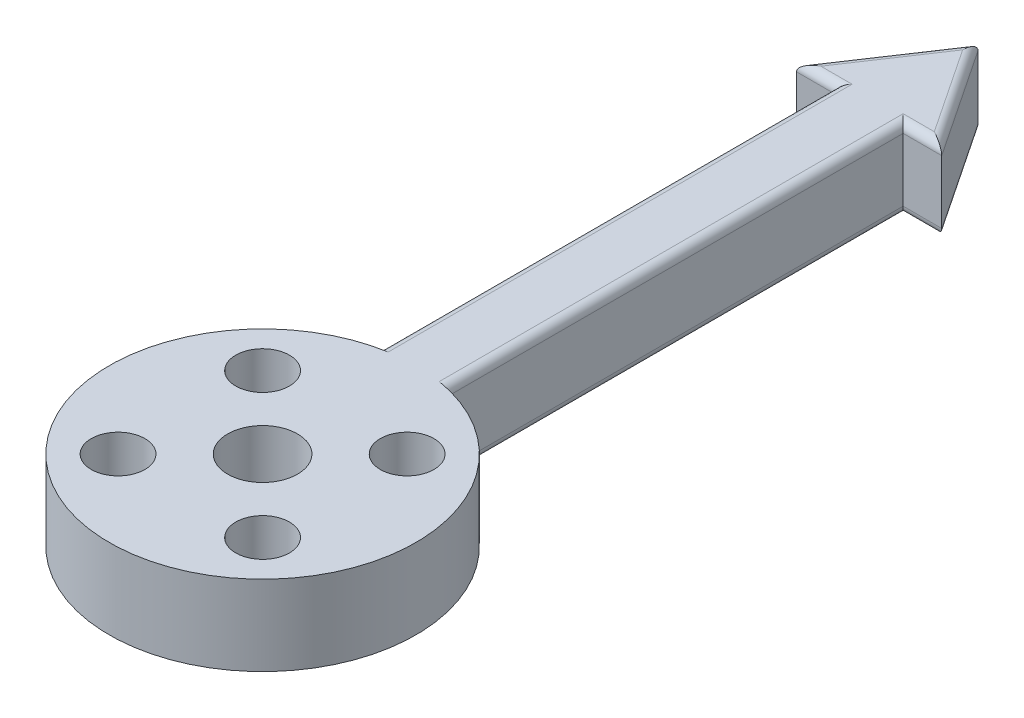
ISO-10303-21;
HEADER;
FILE_DESCRIPTION(('STEP AP214'),'2;1');
FILE_NAME('part.step','',(''),(''),'','','');
FILE_SCHEMA(('AUTOMOTIVE_DESIGN { 1 0 10303 214 1 1 1 1 }'));
ENDSEC;
DATA;
#1=APPLICATION_CONTEXT('core data for automotive mechanical design processes');
#2=APPLICATION_PROTOCOL_DEFINITION('international standard','automotive_design',2000,#1);
#3=PRODUCT_CONTEXT('',#1,'mechanical');
#4=PRODUCT('Part','Part','',(#3));
#5=PRODUCT_RELATED_PRODUCT_CATEGORY('part','',(#4));
#6=PRODUCT_DEFINITION_FORMATION('','',#4);
#7=PRODUCT_DEFINITION_CONTEXT('part definition',#1,'design');
#8=PRODUCT_DEFINITION('design','',#6,#7);
#9=PRODUCT_DEFINITION_SHAPE('','',#8);
#10=(LENGTH_UNIT() NAMED_UNIT(*) SI_UNIT(.MILLI.,.METRE.));
#11=(NAMED_UNIT(*) PLANE_ANGLE_UNIT() SI_UNIT($,.RADIAN.));
#12=(NAMED_UNIT(*) SI_UNIT($,.STERADIAN.) SOLID_ANGLE_UNIT());
#13=UNCERTAINTY_MEASURE_WITH_UNIT(LENGTH_MEASURE(1.E-05),#10,'distance_accuracy_value','');
#14=(GEOMETRIC_REPRESENTATION_CONTEXT(3) GLOBAL_UNCERTAINTY_ASSIGNED_CONTEXT((#13)) GLOBAL_UNIT_ASSIGNED_CONTEXT((#10,
#11,#12)) REPRESENTATION_CONTEXT('',''));
#15=CARTESIAN_POINT('',(0.,0.,0.));
#16=DIRECTION('',(0.,0.,1.));
#17=DIRECTION('',(1.,0.,0.));
#18=AXIS2_PLACEMENT_3D('',#15,#16,#17);
#19=CARTESIAN_POINT('',(0.,4.7,0.));
#20=DIRECTION('',(0.,1.,0.));
#21=DIRECTION('',(0.,0.,1.));
#22=AXIS2_PLACEMENT_3D('',#19,#20,#21);
#23=PLANE('',#22);
#24=CARTESIAN_POINT('',(4.24264068711929,4.7,4.24264068711927));
#25=DIRECTION('',(0.,1.,0.));
#26=DIRECTION('',(0.,0.,1.));
#27=AXIS2_PLACEMENT_3D('',#24,#25,#26);
#28=CIRCLE('',#27,1.575);
#29=CARTESIAN_POINT('',(4.24264068711929,4.7,5.81764068711927));
#30=VERTEX_POINT('',#29);
#31=EDGE_CURVE('E353',#30,#30,#28,.T.);
#32=ORIENTED_EDGE('',*,*,#31,.F.);
#33=EDGE_LOOP('',(#32));
#34=FACE_BOUND('',#33,.T.);
#35=CARTESIAN_POINT('',(-4.24264068711929,4.7,-4.24264068711928));
#36=DIRECTION('',(0.,1.,0.));
#37=DIRECTION('',(0.,0.,1.));
#38=AXIS2_PLACEMENT_3D('',#35,#36,#37);
#39=CIRCLE('',#38,1.575);
#40=CARTESIAN_POINT('',(-4.24264068711929,4.7,-2.66764068711928));
#41=VERTEX_POINT('',#40);
#42=EDGE_CURVE('E365',#41,#41,#39,.T.);
#43=ORIENTED_EDGE('',*,*,#42,.F.);
#44=EDGE_LOOP('',(#43));
#45=FACE_BOUND('',#44,.T.);
#46=CARTESIAN_POINT('',(0.,4.7,0.));
#47=DIRECTION('',(0.,1.,0.));
#48=DIRECTION('',(0.,0.,1.));
#49=AXIS2_PLACEMENT_3D('',#46,#47,#48);
#50=CIRCLE('',#49,9.);
#51=CARTESIAN_POINT('',(-1.5,4.7,-8.87411967464942));
#52=VERTEX_POINT('',#51);
#53=CARTESIAN_POINT('',(1.5,4.7,-8.87411967464942));
#54=VERTEX_POINT('',#53);
#55=EDGE_CURVE('E149',#52,#54,#50,.T.);
#56=ORIENTED_EDGE('',*,*,#55,.T.);
#57=DIRECTION('',(0.,0.,-1.));
#58=VECTOR('',#57,1.);
#59=CARTESIAN_POINT('',(1.5,4.7,0.));
#60=LINE('',#59,#58);
#61=CARTESIAN_POINT('',(1.5,4.7,-36.1063758050143));
#62=VERTEX_POINT('',#61);
#63=EDGE_CURVE('E198',#54,#62,#60,.T.);
#64=ORIENTED_EDGE('',*,*,#63,.T.);
#65=DIRECTION('',(1.,0.,0.));
#66=VECTOR('',#65,1.);
#67=CARTESIAN_POINT('',(0.,4.7,-36.1063758050143));
#68=LINE('',#67,#66);
#69=CARTESIAN_POINT('',(3.33042474295131,4.7,-36.1063758050143));
#70=VERTEX_POINT('',#69);
#71=EDGE_CURVE('E195',#62,#70,#68,.T.);
#72=ORIENTED_EDGE('',*,*,#71,.T.);
#73=DIRECTION('',(-0.554932665474473,0.,-0.831895267921027));
#74=VECTOR('',#73,1.);
#75=CARTESIAN_POINT('',(18.9731784198062,4.7,-12.6564447221081));
#76=LINE('',#75,#74);
#77=CARTESIAN_POINT('',(0.,4.7,-41.0989897854139));
#78=VERTEX_POINT('',#77);
#79=EDGE_CURVE('E193',#70,#78,#76,.T.);
#80=ORIENTED_EDGE('',*,*,#79,.T.);
#81=DIRECTION('',(-0.554932665474473,0.,0.831895267921027));
#82=VECTOR('',#81,1.);
#83=CARTESIAN_POINT('',(-18.9731784198062,4.7,-12.6564447221081));
#84=LINE('',#83,#82);
#85=CARTESIAN_POINT('',(-3.3304247429513,4.7,-36.1063758050143));
#86=VERTEX_POINT('',#85);
#87=EDGE_CURVE('E191',#78,#86,#84,.T.);
#88=ORIENTED_EDGE('',*,*,#87,.T.);
#89=DIRECTION('',(1.,0.,0.));
#90=VECTOR('',#89,1.);
#91=CARTESIAN_POINT('',(0.,4.7,-36.1063758050143));
#92=LINE('',#91,#90);
#93=CARTESIAN_POINT('',(-1.5,4.7,-36.1063758050143));
#94=VERTEX_POINT('',#93);
#95=EDGE_CURVE('E189',#86,#94,#92,.T.);
#96=ORIENTED_EDGE('',*,*,#95,.T.);
#97=DIRECTION('',(0.,0.,1.));
#98=VECTOR('',#97,1.);
#99=CARTESIAN_POINT('',(-1.5,4.7,0.));
#100=LINE('',#99,#98);
#101=EDGE_CURVE('E186',#94,#52,#100,.T.);
#102=ORIENTED_EDGE('',*,*,#101,.T.);
#103=EDGE_LOOP('',(#56,#64,#72,#80,#88,#96,#102));
#104=FACE_BOUND('',#103,.T.);
#105=CARTESIAN_POINT('',(0.,4.7,0.));
#106=DIRECTION('',(0.,1.,0.));
#107=DIRECTION('',(0.,0.,1.));
#108=AXIS2_PLACEMENT_3D('',#105,#106,#107);
#109=CIRCLE('',#108,2.05);
#110=CARTESIAN_POINT('',(0.,4.7,2.05));
#111=VERTEX_POINT('',#110);
#112=EDGE_CURVE('E150',#111,#111,#109,.T.);
#113=ORIENTED_EDGE('',*,*,#112,.F.);
#114=EDGE_LOOP('',(#113));
#115=FACE_BOUND('',#114,.T.);
#116=CARTESIAN_POINT('',(-4.24264068711928,4.7,4.24264068711929));
#117=DIRECTION('',(0.,1.,0.));
#118=DIRECTION('',(0.,0.,1.));
#119=AXIS2_PLACEMENT_3D('',#116,#117,#118);
#120=CIRCLE('',#119,1.575);
#121=CARTESIAN_POINT('',(-4.24264068711928,4.7,5.81764068711929));
#122=VERTEX_POINT('',#121);
#123=EDGE_CURVE('E359',#122,#122,#120,.T.);
#124=ORIENTED_EDGE('',*,*,#123,.F.);
#125=EDGE_LOOP('',(#124));
#126=FACE_BOUND('',#125,.T.);
#127=CARTESIAN_POINT('',(4.24264068711927,4.7,-4.2426406871193));
#128=DIRECTION('',(0.,1.,0.));
#129=DIRECTION('',(0.,0.,1.));
#130=AXIS2_PLACEMENT_3D('',#127,#128,#129);
#131=CIRCLE('',#130,1.575);
#132=CARTESIAN_POINT('',(4.24264068711927,4.7,-2.6676406871193));
#133=VERTEX_POINT('',#132);
#134=EDGE_CURVE('E345',#133,#133,#131,.T.);
#135=ORIENTED_EDGE('',*,*,#134,.F.);
#136=EDGE_LOOP('',(#135));
#137=FACE_BOUND('',#136,.T.);
#138=ADVANCED_FACE('F37',(#34,#45,#104,#115,#126,#137),#23,.T.);
#139=CARTESIAN_POINT('',(0.,0.,0.));
#140=DIRECTION('',(0.,1.,0.));
#141=DIRECTION('',(0.,0.,1.));
#142=AXIS2_PLACEMENT_3D('',#139,#140,#141);
#143=PLANE('',#142);
#144=DIRECTION('',(0.,0.,1.));
#145=VECTOR('',#144,1.);
#146=CARTESIAN_POINT('',(1.5,0.,-8.77496438739212));
#147=LINE('',#146,#145);
#148=CARTESIAN_POINT('',(1.5,0.,-36.1063758050143));
#149=VERTEX_POINT('',#148);
#150=CARTESIAN_POINT('',(1.5,0.,-8.87411967464942));
#151=VERTEX_POINT('',#150);
#152=EDGE_CURVE('E147',#149,#151,#147,.T.);
#153=ORIENTED_EDGE('',*,*,#152,.T.);
#154=CARTESIAN_POINT('',(0.,0.,0.));
#155=DIRECTION('',(0.,1.,0.));
#156=DIRECTION('',(0.,0.,1.));
#157=AXIS2_PLACEMENT_3D('',#154,#155,#156);
#158=CIRCLE('',#157,9.);
#159=CARTESIAN_POINT('',(-1.5,0.,-8.87411967464942));
#160=VERTEX_POINT('',#159);
#161=EDGE_CURVE('E139',#160,#151,#158,.T.);
#162=ORIENTED_EDGE('',*,*,#161,.F.);
#163=DIRECTION('',(0.,0.,-1.));
#164=VECTOR('',#163,1.);
#165=CARTESIAN_POINT('',(-1.5,0.,-35.6063758050143));
#166=LINE('',#165,#164);
#167=CARTESIAN_POINT('',(-1.5,0.,-36.1063758050143));
#168=VERTEX_POINT('',#167);
#169=EDGE_CURVE('E144',#160,#168,#166,.T.);
#170=ORIENTED_EDGE('',*,*,#169,.T.);
#171=DIRECTION('',(-1.,0.,0.));
#172=VECTOR('',#171,1.);
#173=CARTESIAN_POINT('',(-4.26499711367795,0.,-36.1063758050143));
#174=LINE('',#173,#172);
#175=CARTESIAN_POINT('',(-3.3304247429513,0.,-36.1063758050143));
#176=VERTEX_POINT('',#175);
#177=EDGE_CURVE('E162',#168,#176,#174,.T.);
#178=ORIENTED_EDGE('',*,*,#177,.T.);
#179=DIRECTION('',(0.554932665474473,0.,-0.831895267921027));
#180=VECTOR('',#179,1.);
#181=CARTESIAN_POINT('',(0.415947633960519,0.,-41.7225336672628));
#182=LINE('',#181,#180);
#183=CARTESIAN_POINT('',(0.,0.,-41.0989897854139));
#184=VERTEX_POINT('',#183);
#185=EDGE_CURVE('E164',#176,#184,#182,.T.);
#186=ORIENTED_EDGE('',*,*,#185,.T.);
#187=DIRECTION('',(0.554932665474473,0.,0.831895267921027));
#188=VECTOR('',#187,1.);
#189=CARTESIAN_POINT('',(3.84904947971744,0.,-35.328909472277));
#190=LINE('',#189,#188);
#191=CARTESIAN_POINT('',(3.33042474295131,0.,-36.1063758050143));
#192=VERTEX_POINT('',#191);
#193=EDGE_CURVE('E169',#184,#192,#190,.T.);
#194=ORIENTED_EDGE('',*,*,#193,.T.);
#195=DIRECTION('',(-1.,0.,0.));
#196=VECTOR('',#195,1.);
#197=CARTESIAN_POINT('',(2.,0.,-36.1063758050143));
#198=LINE('',#197,#196);
#199=EDGE_CURVE('E171',#192,#149,#198,.T.);
#200=ORIENTED_EDGE('',*,*,#199,.T.);
#201=EDGE_LOOP('',(#153,#162,#170,#178,#186,#194,#200));
#202=FACE_BOUND('',#201,.T.);
#203=CARTESIAN_POINT('',(0.,0.,0.));
#204=DIRECTION('',(0.,1.,0.));
#205=DIRECTION('',(0.,0.,1.));
#206=AXIS2_PLACEMENT_3D('',#203,#204,#205);
#207=CIRCLE('',#206,2.05);
#208=CARTESIAN_POINT('',(0.,0.,2.05));
#209=VERTEX_POINT('',#208);
#210=EDGE_CURVE('E368',#209,#209,#207,.T.);
#211=ORIENTED_EDGE('',*,*,#210,.T.);
#212=EDGE_LOOP('',(#211));
#213=FACE_BOUND('',#212,.T.);
#214=CARTESIAN_POINT('',(-4.24264068711929,0.,-4.24264068711928));
#215=DIRECTION('',(0.,1.,0.));
#216=DIRECTION('',(0.,0.,1.));
#217=AXIS2_PLACEMENT_3D('',#214,#215,#216);
#218=CIRCLE('',#217,1.575);
#219=CARTESIAN_POINT('',(-4.24264068711929,0.,-2.66764068711928));
#220=VERTEX_POINT('',#219);
#221=EDGE_CURVE('E362',#220,#220,#218,.T.);
#222=ORIENTED_EDGE('',*,*,#221,.T.);
#223=EDGE_LOOP('',(#222));
#224=FACE_BOUND('',#223,.T.);
#225=CARTESIAN_POINT('',(-4.24264068711928,0.,4.24264068711929));
#226=DIRECTION('',(0.,1.,0.));
#227=DIRECTION('',(0.,0.,1.));
#228=AXIS2_PLACEMENT_3D('',#225,#226,#227);
#229=CIRCLE('',#228,1.575);
#230=CARTESIAN_POINT('',(-4.24264068711928,0.,5.81764068711929));
#231=VERTEX_POINT('',#230);
#232=EDGE_CURVE('E356',#231,#231,#229,.T.);
#233=ORIENTED_EDGE('',*,*,#232,.T.);
#234=EDGE_LOOP('',(#233));
#235=FACE_BOUND('',#234,.T.);
#236=CARTESIAN_POINT('',(4.24264068711929,0.,4.24264068711927));
#237=DIRECTION('',(0.,1.,0.));
#238=DIRECTION('',(0.,0.,1.));
#239=AXIS2_PLACEMENT_3D('',#236,#237,#238);
#240=CIRCLE('',#239,1.575);
#241=CARTESIAN_POINT('',(4.24264068711929,0.,5.81764068711927));
#242=VERTEX_POINT('',#241);
#243=EDGE_CURVE('E348',#242,#242,#240,.T.);
#244=ORIENTED_EDGE('',*,*,#243,.T.);
#245=EDGE_LOOP('',(#244));
#246=FACE_BOUND('',#245,.T.);
#247=CARTESIAN_POINT('',(4.24264068711927,0.,-4.2426406871193));
#248=DIRECTION('',(0.,1.,0.));
#249=DIRECTION('',(0.,0.,1.));
#250=AXIS2_PLACEMENT_3D('',#247,#248,#249);
#251=CIRCLE('',#250,1.575);
#252=CARTESIAN_POINT('',(4.24264068711927,0.,-2.6676406871193));
#253=VERTEX_POINT('',#252);
#254=EDGE_CURVE('E349',#253,#253,#251,.T.);
#255=ORIENTED_EDGE('',*,*,#254,.T.);
#256=EDGE_LOOP('',(#255));
#257=FACE_BOUND('',#256,.T.);
#258=ADVANCED_FACE('F141',(#202,#213,#224,#235,#246,#257),#143,.F.);
#259=CARTESIAN_POINT('',(0.,4.7,0.));
#260=DIRECTION('',(0.,-1.,0.));
#261=DIRECTION('',(0.,0.,-1.));
#262=AXIS2_PLACEMENT_3D('',#259,#260,#261);
#263=CYLINDRICAL_SURFACE('',#262,9.);
#264=ORIENTED_EDGE('',*,*,#161,.T.);
#265=CARTESIAN_POINT('',(1.5,0.,-8.87411967464942));
#266=CARTESIAN_POINT('',(1.52857366768559,-2.15510290243616E-05,-8.86929528128419));
#267=CARTESIAN_POINT('',(1.55711328798484,0.00244793500486232,-8.86432397944998));
#268=CARTESIAN_POINT('',(1.6133244305924,0.0121836103916337,-8.85426300443382));
#269=CARTESIAN_POINT('',(1.64099645050938,0.0194469954826103,-8.84917340213173));
#270=CARTESIAN_POINT('',(1.69471837865524,0.0385893348917998,-8.83904320058754));
#271=CARTESIAN_POINT('',(1.72076763257275,0.050470137188911,-8.83400262179454));
#272=CARTESIAN_POINT('',(1.77049356807728,0.0785175592642949,-8.82417098797605));
#273=CARTESIAN_POINT('',(1.79417066519858,0.0946834266061128,-8.81937988931961));
#274=CARTESIAN_POINT('',(1.8384269039602,0.130835896918449,-8.81026091521211));
#275=CARTESIAN_POINT('',(1.85901209499855,0.150814860761542,-8.80593214013922));
#276=CARTESIAN_POINT('',(1.89652364257216,0.19407770593054,-8.79792968970481));
#277=CARTESIAN_POINT('',(1.91344952420451,0.217362015573363,-8.79425609938358));
#278=CARTESIAN_POINT('',(1.94285771161938,0.266171022688308,-8.78780562653102));
#279=CARTESIAN_POINT('',(1.9554079225013,0.291653037123858,-8.78501510931863));
#280=CARTESIAN_POINT('',(1.97602762824572,0.344440631991479,-8.78040018686233));
#281=CARTESIAN_POINT('',(1.98410125791107,0.37174450345314,-8.77857489016304));
#282=CARTESIAN_POINT('',(1.99319228185887,0.416056029680713,-8.77651389649273));
#283=CARTESIAN_POINT('',(1.9957434690092,0.43274832288734,-8.77593374258027));
#284=CARTESIAN_POINT('',(1.9991469482704,0.46629100344544,-8.77515883242661));
#285=CARTESIAN_POINT('',(2.00000154859611,0.483141144621757,-8.77496355256496));
#286=CARTESIAN_POINT('',(2.,0.5,-8.77496438739212));
#287=B_SPLINE_CURVE_WITH_KNOTS('',3,(#265,#266,#267,#268,#269,#270,#271,#272,#273,#274,#275,
#276,#277,#278,#279,#280,#281,#282,#283,#284,#285,#286),.UNSPECIFIED.,.F.,.F.,(4,2,2,2,2,2,2,2,
2,2,4),(0.,0.0868162135104531,0.173581687554039,0.26038192262273,0.347166926080157,
0.433779856325748,0.520404020405123,0.605616837146022,0.6907508152316,0.741356534728941,
0.791893357579761),.UNSPECIFIED.);
#288=CARTESIAN_POINT('',(2.,0.5,-8.77496438739212));
#289=VERTEX_POINT('',#288);
#290=EDGE_CURVE('E211',#151,#289,#287,.T.);
#291=ORIENTED_EDGE('',*,*,#290,.T.);
#292=DIRECTION('',(0.,1.,0.));
#293=VECTOR('',#292,1.);
#294=CARTESIAN_POINT('',(2.,-34.3025333317787,-8.77496438739212));
#295=LINE('',#294,#293);
#296=CARTESIAN_POINT('',(2.,4.2,-8.77496438739212));
#297=VERTEX_POINT('',#296);
#298=EDGE_CURVE('E337',#289,#297,#295,.T.);
#299=ORIENTED_EDGE('',*,*,#298,.T.);
#300=CARTESIAN_POINT('',(2.,4.2,-8.77496438739212));
#301=CARTESIAN_POINT('',(2.0000259749314,4.2276586310233,-8.77495473762469));
#302=CARTESIAN_POINT('',(1.99770668779364,4.25530499134648,-8.77548703518185));
#303=CARTESIAN_POINT('',(1.98857547794365,4.30976321890986,-8.77756268389682));
#304=CARTESIAN_POINT('',(1.98177069187122,4.33657634102491,-8.77910442895008));
#305=CARTESIAN_POINT('',(1.96386360374433,4.38865554502999,-8.78312692140167));
#306=CARTESIAN_POINT('',(1.95276051889964,4.41392134415602,-8.78560783983695));
#307=CARTESIAN_POINT('',(1.92660940206455,4.46221786035978,-8.79137964475677));
#308=CARTESIAN_POINT('',(1.91156111471106,4.48524843262461,-8.79467058367107));
#309=CARTESIAN_POINT('',(1.87775252020999,4.52874188023792,-8.80195131347186));
#310=CARTESIAN_POINT('',(1.85894858475035,4.54916945664228,-8.80594924804119));
#311=CARTESIAN_POINT('',(1.81828433422215,4.58659923903385,-8.81443548270603));
#312=CARTESIAN_POINT('',(1.7964232277161,4.60360055524315,-8.81892390971377));
#313=CARTESIAN_POINT('',(1.74972955167514,4.63408526254806,-8.8283081879939));
#314=CARTESIAN_POINT('',(1.7248414218102,4.64748138900918,-8.83321091020234));
#315=CARTESIAN_POINT('',(1.67319256380394,4.66988928136201,-8.84313953426376));
#316=CARTESIAN_POINT('',(1.64643262790724,4.67890288947011,-8.84816538342482));
#317=CARTESIAN_POINT('',(1.59964196545976,4.69038146012261,-8.85672273361956));
#318=CARTESIAN_POINT('',(1.57988506769198,4.69398358888401,-8.86026898973637));
#319=CARTESIAN_POINT('',(1.54009213640419,4.69879305734944,-8.86727292204304));
#320=CARTESIAN_POINT('',(1.52005647714948,4.7000033447503,-8.87073070207394));
#321=CARTESIAN_POINT('',(1.5,4.7,-8.87411967464942));
#322=B_SPLINE_CURVE_WITH_KNOTS('',3,(#300,#301,#302,#303,#304,#305,#306,#307,#308,#309,#310,
#311,#312,#313,#314,#315,#316,#317,#318,#319,#320,#321),.UNSPECIFIED.,.F.,.F.,(4,2,2,2,2,2,2,2,
2,2,4),(0.,0.0828551806665469,0.165578852009707,0.248317595773538,0.331061696332102,
0.414829670181769,0.498619370086447,0.584284638225216,0.669913865284192,0.730958352927629,
0.79192756252969),.UNSPECIFIED.);
#323=EDGE_CURVE('E156',#297,#54,#322,.T.);
#324=ORIENTED_EDGE('',*,*,#323,.T.);
#325=ORIENTED_EDGE('',*,*,#55,.F.);
#326=CARTESIAN_POINT('',(-1.5,4.7,-8.87411967464942));
#327=CARTESIAN_POINT('',(-1.52857366768559,4.70002155102902,-8.8692952812842));
#328=CARTESIAN_POINT('',(-1.55711328798484,4.69755206499514,-8.86432397944998));
#329=CARTESIAN_POINT('',(-1.6133244305924,4.68781638960837,-8.85426300443382));
#330=CARTESIAN_POINT('',(-1.64099645050938,4.68055300451739,-8.84917340213173));
#331=CARTESIAN_POINT('',(-1.69471837865524,4.6614106651082,-8.83904320058754));
#332=CARTESIAN_POINT('',(-1.72076763257275,4.64952986281109,-8.83400262179454));
#333=CARTESIAN_POINT('',(-1.77049356807728,4.62148244073571,-8.82417098797605));
#334=CARTESIAN_POINT('',(-1.79417066519858,4.60531657339389,-8.81937988931961));
#335=CARTESIAN_POINT('',(-1.8384269039602,4.56916410308155,-8.81026091521211));
#336=CARTESIAN_POINT('',(-1.85901209499855,4.54918513923846,-8.80593214013922));
#337=CARTESIAN_POINT('',(-1.89652364257216,4.50592229406946,-8.79792968970481));
#338=CARTESIAN_POINT('',(-1.91344952420451,4.48263798442664,-8.79425609938358));
#339=CARTESIAN_POINT('',(-1.94285771161938,4.43382897731169,-8.78780562653102));
#340=CARTESIAN_POINT('',(-1.9554079225013,4.40834696287614,-8.78501510931863));
#341=CARTESIAN_POINT('',(-1.97602762824572,4.35555936800852,-8.78040018686233));
#342=CARTESIAN_POINT('',(-1.98410125791107,4.32825549654686,-8.77857489016304));
#343=CARTESIAN_POINT('',(-1.99319228185887,4.28394397031929,-8.77651389649273));
#344=CARTESIAN_POINT('',(-1.9957434690092,4.26725167711266,-8.77593374258027));
#345=CARTESIAN_POINT('',(-1.9991469482704,4.23370899655456,-8.77515883242661));
#346=CARTESIAN_POINT('',(-2.00000154859611,4.21685885537824,-8.77496355256496));
#347=CARTESIAN_POINT('',(-2.,4.2,-8.77496438739212));
#348=B_SPLINE_CURVE_WITH_KNOTS('',3,(#326,#327,#328,#329,#330,#331,#332,#333,#334,#335,#336,
#337,#338,#339,#340,#341,#342,#343,#344,#345,#346,#347),.UNSPECIFIED.,.F.,.F.,(4,2,2,2,2,2,2,2,
2,2,4),(0.,0.0868162135104529,0.173581687554039,0.26038192262273,0.347166926080157,
0.433779856325748,0.520404020405124,0.605616837146022,0.6907508152316,0.741356534728941,
0.791893357579761),.UNSPECIFIED.);
#349=CARTESIAN_POINT('',(-2.,4.2,-8.77496438739212));
#350=VERTEX_POINT('',#349);
#351=EDGE_CURVE('E11',#52,#350,#348,.T.);
#352=ORIENTED_EDGE('',*,*,#351,.T.);
#353=DIRECTION('',(0.,1.,0.));
#354=VECTOR('',#353,1.);
#355=CARTESIAN_POINT('',(-2.,-34.3025333317787,-8.77496438739212));
#356=LINE('',#355,#354);
#357=CARTESIAN_POINT('',(-2.,0.5,-8.77496438739212));
#358=VERTEX_POINT('',#357);
#359=EDGE_CURVE('E154',#358,#350,#356,.T.);
#360=ORIENTED_EDGE('',*,*,#359,.F.);
#361=CARTESIAN_POINT('',(-2.,0.5,-8.77496438739212));
#362=CARTESIAN_POINT('',(-2.0000259749314,0.472341368976697,-8.77495473762469));
#363=CARTESIAN_POINT('',(-1.99770668779364,0.444695008653521,-8.77548703518185));
#364=CARTESIAN_POINT('',(-1.98857547794365,0.390236781090141,-8.77756268389682));
#365=CARTESIAN_POINT('',(-1.98177069187122,0.363423658975087,-8.77910442895008));
#366=CARTESIAN_POINT('',(-1.96386360374433,0.311344454970011,-8.78312692140167));
#367=CARTESIAN_POINT('',(-1.95276051889964,0.286078655843985,-8.78560783983695));
#368=CARTESIAN_POINT('',(-1.92660940206455,0.237782139640217,-8.79137964475677));
#369=CARTESIAN_POINT('',(-1.91156111471106,0.214751567375386,-8.79467058367107));
#370=CARTESIAN_POINT('',(-1.87775252020999,0.17125811976208,-8.80195131347186));
#371=CARTESIAN_POINT('',(-1.85894858475035,0.150830543357722,-8.80594924804119));
#372=CARTESIAN_POINT('',(-1.81828433422215,0.113400760966151,-8.81443548270603));
#373=CARTESIAN_POINT('',(-1.7964232277161,0.096399444756849,-8.81892390971377));
#374=CARTESIAN_POINT('',(-1.74972955167514,0.065914737451942,-8.8283081879939));
#375=CARTESIAN_POINT('',(-1.7248414218102,0.0525186109908235,-8.83321091020234));
#376=CARTESIAN_POINT('',(-1.67319256380394,0.0301107186379901,-8.84313953426376));
#377=CARTESIAN_POINT('',(-1.64643262790724,0.0210971105298855,-8.84816538342482));
#378=CARTESIAN_POINT('',(-1.59964196545976,0.00961853987739537,-8.85672273361956));
#379=CARTESIAN_POINT('',(-1.57988506769198,0.00601641111599346,-8.86026898973637));
#380=CARTESIAN_POINT('',(-1.54009213640419,0.00120694265056098,-8.86727292204304));
#381=CARTESIAN_POINT('',(-1.52005647714948,-3.3447502998706E-06,-8.87073070207394));
#382=CARTESIAN_POINT('',(-1.5,0.,-8.87411967464942));
#383=B_SPLINE_CURVE_WITH_KNOTS('',3,(#361,#362,#363,#364,#365,#366,#367,#368,#369,#370,#371,
#372,#373,#374,#375,#376,#377,#378,#379,#380,#381,#382),.UNSPECIFIED.,.F.,.F.,(4,2,2,2,2,2,2,2,
2,2,4),(0.,0.0828551806665472,0.165578852009707,0.248317595773539,0.331061696332102,
0.414829670181769,0.498619370086447,0.584284638225216,0.669913865284192,0.730958352927629,
0.791927562529691),.UNSPECIFIED.);
#384=EDGE_CURVE('E47',#358,#160,#383,.T.);
#385=ORIENTED_EDGE('',*,*,#384,.T.);
#386=EDGE_LOOP('',(#264,#291,#299,#324,#325,#352,#360,#385));
#387=FACE_BOUND('',#386,.T.);
#388=ADVANCED_FACE('F153',(#387),#263,.T.);
#389=CARTESIAN_POINT('',(0.,4.7,0.));
#390=DIRECTION('',(0.,-1.,0.));
#391=DIRECTION('',(0.,0.,-1.));
#392=AXIS2_PLACEMENT_3D('',#389,#390,#391);
#393=CYLINDRICAL_SURFACE('',#392,2.05);
#394=ORIENTED_EDGE('',*,*,#112,.T.);
#395=EDGE_LOOP('',(#394));
#396=FACE_BOUND('',#395,.T.);
#397=ORIENTED_EDGE('',*,*,#210,.F.);
#398=EDGE_LOOP('',(#397));
#399=FACE_BOUND('',#398,.T.);
#400=ADVANCED_FACE('F377',(#396,#399),#393,.F.);
#401=CARTESIAN_POINT('',(-4.24264068711929,4.7,-4.24264068711928));
#402=DIRECTION('',(0.,-1.,0.));
#403=DIRECTION('',(0.,0.,-1.));
#404=AXIS2_PLACEMENT_3D('',#401,#402,#403);
#405=CYLINDRICAL_SURFACE('',#404,1.575);
#406=ORIENTED_EDGE('',*,*,#42,.T.);
#407=EDGE_LOOP('',(#406));
#408=FACE_BOUND('',#407,.T.);
#409=ORIENTED_EDGE('',*,*,#221,.F.);
#410=EDGE_LOOP('',(#409));
#411=FACE_BOUND('',#410,.T.);
#412=ADVANCED_FACE('F379',(#408,#411),#405,.F.);
#413=CARTESIAN_POINT('',(-4.24264068711928,4.7,4.24264068711929));
#414=DIRECTION('',(0.,-1.,0.));
#415=DIRECTION('',(0.,0.,-1.));
#416=AXIS2_PLACEMENT_3D('',#413,#414,#415);
#417=CYLINDRICAL_SURFACE('',#416,1.575);
#418=ORIENTED_EDGE('',*,*,#123,.T.);
#419=EDGE_LOOP('',(#418));
#420=FACE_BOUND('',#419,.T.);
#421=ORIENTED_EDGE('',*,*,#232,.F.);
#422=EDGE_LOOP('',(#421));
#423=FACE_BOUND('',#422,.T.);
#424=ADVANCED_FACE('F386',(#420,#423),#417,.F.);
#425=CARTESIAN_POINT('',(4.24264068711929,4.7,4.24264068711927));
#426=DIRECTION('',(0.,-1.,0.));
#427=DIRECTION('',(0.,0.,-1.));
#428=AXIS2_PLACEMENT_3D('',#425,#426,#427);
#429=CYLINDRICAL_SURFACE('',#428,1.575);
#430=ORIENTED_EDGE('',*,*,#31,.T.);
#431=EDGE_LOOP('',(#430));
#432=FACE_BOUND('',#431,.T.);
#433=ORIENTED_EDGE('',*,*,#243,.F.);
#434=EDGE_LOOP('',(#433));
#435=FACE_BOUND('',#434,.T.);
#436=ADVANCED_FACE('F410',(#432,#435),#429,.F.);
#437=CARTESIAN_POINT('',(4.24264068711927,4.7,-4.2426406871193));
#438=DIRECTION('',(0.,-1.,0.));
#439=DIRECTION('',(0.,0.,-1.));
#440=AXIS2_PLACEMENT_3D('',#437,#438,#439);
#441=CYLINDRICAL_SURFACE('',#440,1.575);
#442=ORIENTED_EDGE('',*,*,#134,.T.);
#443=EDGE_LOOP('',(#442));
#444=FACE_BOUND('',#443,.T.);
#445=ORIENTED_EDGE('',*,*,#254,.F.);
#446=EDGE_LOOP('',(#445));
#447=FACE_BOUND('',#446,.T.);
#448=ADVANCED_FACE('F407',(#444,#447),#441,.F.);
#449=CARTESIAN_POINT('',(-2.,-34.3025333317787,-35.6063758050143));
#450=DIRECTION('',(0.,0.,1.));
#451=DIRECTION('',(1.,0.,0.));
#452=AXIS2_PLACEMENT_3D('',#449,#450,#451);
#453=PLANE('',#452);
#454=DIRECTION('',(0.,1.,0.));
#455=VECTOR('',#454,1.);
#456=CARTESIAN_POINT('',(-4.26499711367795,-34.3025333317787,-35.6063758050143));
#457=LINE('',#456,#455);
#458=CARTESIAN_POINT('',(-4.26499711367795,0.5,-35.6063758050143));
#459=VERTEX_POINT('',#458);
#460=CARTESIAN_POINT('',(-4.26499711367795,4.2,-35.6063758050143));
#461=VERTEX_POINT('',#460);
#462=EDGE_CURVE('E352',#459,#461,#457,.T.);
#463=ORIENTED_EDGE('',*,*,#462,.F.);
#464=DIRECTION('',(-1.,0.,0.));
#465=VECTOR('',#464,1.);
#466=CARTESIAN_POINT('',(-2.,0.5,-35.6063758050143));
#467=LINE('',#466,#465);
#468=CARTESIAN_POINT('',(-2.,0.5,-35.6063758050143));
#469=VERTEX_POINT('',#468);
#470=EDGE_CURVE('E206',#459,#469,#467,.F.);
#471=ORIENTED_EDGE('',*,*,#470,.T.);
#472=DIRECTION('',(0.,1.,0.));
#473=VECTOR('',#472,1.);
#474=CARTESIAN_POINT('',(-2.,-34.3025333317787,-35.6063758050143));
#475=LINE('',#474,#473);
#476=CARTESIAN_POINT('',(-2.,4.2,-35.6063758050143));
#477=VERTEX_POINT('',#476);
#478=EDGE_CURVE('E275',#469,#477,#475,.T.);
#479=ORIENTED_EDGE('',*,*,#478,.T.);
#480=DIRECTION('',(1.,0.,0.));
#481=VECTOR('',#480,1.);
#482=CARTESIAN_POINT('',(-2.,4.2,-35.6063758050143));
#483=LINE('',#482,#481);
#484=EDGE_CURVE('E204',#477,#461,#483,.F.);
#485=ORIENTED_EDGE('',*,*,#484,.T.);
#486=EDGE_LOOP('',(#463,#471,#479,#485));
#487=FACE_BOUND('',#486,.T.);
#488=ADVANCED_FACE('F409',(#487),#453,.T.);
#489=CARTESIAN_POINT('',(-4.26499711367795,-34.3025333317787,-35.6063758050143));
#490=DIRECTION('',(-0.831895267921026,0.,-0.554932665474473));
#491=DIRECTION('',(-0.554932665474473,0.,0.831895267921027));
#492=AXIS2_PLACEMENT_3D('',#489,#490,#491);
#493=PLANE('',#492);
#494=DIRECTION('',(0.,1.,0.));
#495=VECTOR('',#494,1.);
#496=CARTESIAN_POINT('',(0.,-34.3025333317787,-42.));
#497=LINE('',#496,#495);
#498=CARTESIAN_POINT('',(0.,0.5,-42.));
#499=VERTEX_POINT('',#498);
#500=CARTESIAN_POINT('',(0.,4.2,-42.));
#501=VERTEX_POINT('',#500);
#502=EDGE_CURVE('E316',#499,#501,#497,.T.);
#503=ORIENTED_EDGE('',*,*,#502,.F.);
#504=DIRECTION('',(0.554932665474473,0.,-0.831895267921027));
#505=VECTOR('',#504,1.);
#506=CARTESIAN_POINT('',(-4.26499711367794,0.5,-35.6063758050143));
#507=LINE('',#506,#505);
#508=EDGE_CURVE('E202',#499,#459,#507,.F.);
#509=ORIENTED_EDGE('',*,*,#508,.T.);
#510=ORIENTED_EDGE('',*,*,#462,.T.);
#511=DIRECTION('',(-0.554932665474473,0.,0.831895267921027));
#512=VECTOR('',#511,1.);
#513=CARTESIAN_POINT('',(-4.26499711367795,4.2,-35.6063758050143));
#514=LINE('',#513,#512);
#515=EDGE_CURVE('E200',#461,#501,#514,.F.);
#516=ORIENTED_EDGE('',*,*,#515,.T.);
#517=EDGE_LOOP('',(#503,#509,#510,#516));
#518=FACE_BOUND('',#517,.T.);
#519=ADVANCED_FACE('F417',(#518),#493,.T.);
#520=CARTESIAN_POINT('',(0.,-34.3025333317787,-42.));
#521=DIRECTION('',(0.831895267921026,0.,-0.554932665474473));
#522=DIRECTION('',(-0.554932665474473,0.,-0.831895267921027));
#523=AXIS2_PLACEMENT_3D('',#520,#521,#522);
#524=PLANE('',#523);
#525=DIRECTION('',(0.,1.,0.));
#526=VECTOR('',#525,1.);
#527=CARTESIAN_POINT('',(4.26499711367795,-34.3025333317787,-35.6063758050143));
#528=LINE('',#527,#526);
#529=CARTESIAN_POINT('',(4.26499711367795,0.5,-35.6063758050143));
#530=VERTEX_POINT('',#529);
#531=CARTESIAN_POINT('',(4.26499711367795,4.2,-35.6063758050143));
#532=VERTEX_POINT('',#531);
#533=EDGE_CURVE('E313',#530,#532,#528,.T.);
#534=ORIENTED_EDGE('',*,*,#533,.F.);
#535=DIRECTION('',(0.554932665474473,0.,0.831895267921027));
#536=VECTOR('',#535,1.);
#537=CARTESIAN_POINT('',(0.,0.5,-42.));
#538=LINE('',#537,#536);
#539=EDGE_CURVE('E180',#530,#499,#538,.F.);
#540=ORIENTED_EDGE('',*,*,#539,.T.);
#541=ORIENTED_EDGE('',*,*,#502,.T.);
#542=DIRECTION('',(-0.554932665474473,0.,-0.831895267921027));
#543=VECTOR('',#542,1.);
#544=CARTESIAN_POINT('',(0.,4.2,-42.));
#545=LINE('',#544,#543);
#546=EDGE_CURVE('E178',#501,#532,#545,.F.);
#547=ORIENTED_EDGE('',*,*,#546,.T.);
#548=EDGE_LOOP('',(#534,#540,#541,#547));
#549=FACE_BOUND('',#548,.T.);
#550=ADVANCED_FACE('F312',(#549),#524,.T.);
#551=CARTESIAN_POINT('',(4.26499711367795,-34.3025333317787,-35.6063758050143));
#552=DIRECTION('',(0.,0.,1.));
#553=DIRECTION('',(1.,0.,0.));
#554=AXIS2_PLACEMENT_3D('',#551,#552,#553);
#555=PLANE('',#554);
#556=DIRECTION('',(0.,1.,0.));
#557=VECTOR('',#556,1.);
#558=CARTESIAN_POINT('',(2.,-34.3025333317787,-35.6063758050143));
#559=LINE('',#558,#557);
#560=CARTESIAN_POINT('',(2.,0.5,-35.6063758050143));
#561=VERTEX_POINT('',#560);
#562=CARTESIAN_POINT('',(2.,4.2,-35.6063758050143));
#563=VERTEX_POINT('',#562);
#564=EDGE_CURVE('E323',#561,#563,#559,.T.);
#565=ORIENTED_EDGE('',*,*,#564,.F.);
#566=DIRECTION('',(-1.,0.,0.));
#567=VECTOR('',#566,1.);
#568=CARTESIAN_POINT('',(4.26499711367795,0.5,-35.6063758050143));
#569=LINE('',#568,#567);
#570=EDGE_CURVE('E184',#561,#530,#569,.F.);
#571=ORIENTED_EDGE('',*,*,#570,.T.);
#572=ORIENTED_EDGE('',*,*,#533,.T.);
#573=DIRECTION('',(1.,0.,0.));
#574=VECTOR('',#573,1.);
#575=CARTESIAN_POINT('',(4.26499711367795,4.2,-35.6063758050143));
#576=LINE('',#575,#574);
#577=EDGE_CURVE('E182',#532,#563,#576,.F.);
#578=ORIENTED_EDGE('',*,*,#577,.T.);
#579=EDGE_LOOP('',(#565,#571,#572,#578));
#580=FACE_BOUND('',#579,.T.);
#581=ADVANCED_FACE('F320',(#580),#555,.T.);
#582=CARTESIAN_POINT('',(2.,-34.3025333317787,-35.6063758050143));
#583=DIRECTION('',(1.,0.,0.));
#584=DIRECTION('',(0.,0.,-1.));
#585=AXIS2_PLACEMENT_3D('',#582,#583,#584);
#586=PLANE('',#585);
#587=ORIENTED_EDGE('',*,*,#298,.F.);
#588=DIRECTION('',(0.,0.,1.));
#589=VECTOR('',#588,1.);
#590=CARTESIAN_POINT('',(2.,0.5,-35.6063758050143));
#591=LINE('',#590,#589);
#592=EDGE_CURVE('E176',#289,#561,#591,.F.);
#593=ORIENTED_EDGE('',*,*,#592,.T.);
#594=ORIENTED_EDGE('',*,*,#564,.T.);
#595=DIRECTION('',(0.,0.,-1.));
#596=VECTOR('',#595,1.);
#597=CARTESIAN_POINT('',(2.,4.2,-35.6063758050143));
#598=LINE('',#597,#596);
#599=EDGE_CURVE('E174',#563,#297,#598,.F.);
#600=ORIENTED_EDGE('',*,*,#599,.T.);
#601=EDGE_LOOP('',(#587,#593,#594,#600));
#602=FACE_BOUND('',#601,.T.);
#603=ADVANCED_FACE('F336',(#602),#586,.T.);
#604=CARTESIAN_POINT('',(-2.,-34.3025333317787,-35.6063758050143));
#605=DIRECTION('',(-1.,0.,0.));
#606=DIRECTION('',(0.,0.,1.));
#607=AXIS2_PLACEMENT_3D('',#604,#605,#606);
#608=PLANE('',#607);
#609=ORIENTED_EDGE('',*,*,#478,.F.);
#610=DIRECTION('',(0.,0.,-1.));
#611=VECTOR('',#610,1.);
#612=CARTESIAN_POINT('',(-2.,0.5,-8.77496438739212));
#613=LINE('',#612,#611);
#614=EDGE_CURVE('E60',#469,#358,#613,.F.);
#615=ORIENTED_EDGE('',*,*,#614,.T.);
#616=ORIENTED_EDGE('',*,*,#359,.T.);
#617=DIRECTION('',(0.,0.,1.));
#618=VECTOR('',#617,1.);
#619=CARTESIAN_POINT('',(-2.,4.2,-35.6063758050143));
#620=LINE('',#619,#618);
#621=EDGE_CURVE('E208',#350,#477,#620,.F.);
#622=ORIENTED_EDGE('',*,*,#621,.T.);
#623=EDGE_LOOP('',(#609,#615,#616,#622));
#624=FACE_BOUND('',#623,.T.);
#625=ADVANCED_FACE('F250',(#624),#608,.T.);
#626=CARTESIAN_POINT('',(-1.5,0.5,0.));
#627=DIRECTION('',(0.,0.,1.));
#628=DIRECTION('',(1.,0.,0.));
#629=AXIS2_PLACEMENT_3D('',#626,#627,#628);
#630=CYLINDRICAL_SURFACE('',#629,0.5);
#631=ORIENTED_EDGE('',*,*,#384,.F.);
#632=ORIENTED_EDGE('',*,*,#614,.F.);
#633=CARTESIAN_POINT('',(-1.5,0.5,-36.1063758050143));
#634=DIRECTION('',(0.707106781186547,0.,0.707106781186547));
#635=DIRECTION('',(0.707106781186547,0.,-0.707106781186547));
#636=AXIS2_PLACEMENT_3D('',#633,#634,#635);
#637=ELLIPSE('',#636,0.707106781186547,0.5);
#638=EDGE_CURVE('E160',#168,#469,#637,.F.);
#639=ORIENTED_EDGE('',*,*,#638,.F.);
#640=ORIENTED_EDGE('',*,*,#169,.F.);
#641=EDGE_LOOP('',(#631,#632,#639,#640));
#642=FACE_BOUND('',#641,.T.);
#643=ADVANCED_FACE('F158',(#642),#630,.T.);
#644=CARTESIAN_POINT('',(0.,0.5,-36.1063758050143));
#645=DIRECTION('',(1.,0.,0.));
#646=DIRECTION('',(0.,0.,-1.));
#647=AXIS2_PLACEMENT_3D('',#644,#645,#646);
#648=CYLINDRICAL_SURFACE('',#647,0.5);
#649=ORIENTED_EDGE('',*,*,#638,.T.);
#650=ORIENTED_EDGE('',*,*,#470,.F.);
#651=CARTESIAN_POINT('',(-3.33042474295129,0.5,-36.1063758050143));
#652=DIRECTION('',(0.471734742480097,0.,0.881740513267501));
#653=DIRECTION('',(0.881740513267501,0.,-0.471734742480097));
#654=AXIS2_PLACEMENT_3D('',#651,#652,#653);
#655=ELLIPSE('',#654,1.05991769309019,0.5);
#656=EDGE_CURVE('E271',#176,#459,#655,.F.);
#657=ORIENTED_EDGE('',*,*,#656,.F.);
#658=ORIENTED_EDGE('',*,*,#177,.F.);
#659=EDGE_LOOP('',(#649,#650,#657,#658));
#660=FACE_BOUND('',#659,.T.);
#661=ADVANCED_FACE('F242',(#660),#648,.T.);
#662=CARTESIAN_POINT('',(-18.9731784198062,0.5,-12.6564447221081));
#663=DIRECTION('',(-0.554932665474473,0.,0.831895267921027));
#664=DIRECTION('',(0.831895267921026,0.,0.554932665474473));
#665=AXIS2_PLACEMENT_3D('',#662,#663,#664);
#666=CYLINDRICAL_SURFACE('',#665,0.5);
#667=ORIENTED_EDGE('',*,*,#656,.T.);
#668=ORIENTED_EDGE('',*,*,#508,.F.);
#669=CARTESIAN_POINT('',(0.,0.5,-41.0989897854139));
#670=DIRECTION('',(-1.,0.,0.));
#671=DIRECTION('',(0.,0.,1.));
#672=AXIS2_PLACEMENT_3D('',#669,#670,#671);
#673=ELLIPSE('',#672,0.901010214586116,0.5);
#674=EDGE_CURVE('E268',#184,#499,#673,.F.);
#675=ORIENTED_EDGE('',*,*,#674,.F.);
#676=ORIENTED_EDGE('',*,*,#185,.F.);
#677=EDGE_LOOP('',(#667,#668,#675,#676));
#678=FACE_BOUND('',#677,.T.);
#679=ADVANCED_FACE('F238',(#678),#666,.T.);
#680=CARTESIAN_POINT('',(18.9731784198062,0.5,-12.6564447221081));
#681=DIRECTION('',(-0.554932665474473,0.,-0.831895267921027));
#682=DIRECTION('',(-0.831895267921026,0.,0.554932665474473));
#683=AXIS2_PLACEMENT_3D('',#680,#681,#682);
#684=CYLINDRICAL_SURFACE('',#683,0.5);
#685=ORIENTED_EDGE('',*,*,#674,.T.);
#686=ORIENTED_EDGE('',*,*,#539,.F.);
#687=CARTESIAN_POINT('',(3.3304247429513,0.5,-36.1063758050143));
#688=DIRECTION('',(0.471734742480097,0.,-0.881740513267501));
#689=DIRECTION('',(0.881740513267501,0.,0.471734742480097));
#690=AXIS2_PLACEMENT_3D('',#687,#688,#689);
#691=ELLIPSE('',#690,1.05991769309019,0.5);
#692=EDGE_CURVE('E265',#192,#530,#691,.F.);
#693=ORIENTED_EDGE('',*,*,#692,.F.);
#694=ORIENTED_EDGE('',*,*,#193,.F.);
#695=EDGE_LOOP('',(#685,#686,#693,#694));
#696=FACE_BOUND('',#695,.T.);
#697=ADVANCED_FACE('F234',(#696),#684,.T.);
#698=CARTESIAN_POINT('',(0.,0.5,-36.1063758050143));
#699=DIRECTION('',(1.,0.,0.));
#700=DIRECTION('',(0.,0.,-1.));
#701=AXIS2_PLACEMENT_3D('',#698,#699,#700);
#702=CYLINDRICAL_SURFACE('',#701,0.5);
#703=ORIENTED_EDGE('',*,*,#692,.T.);
#704=ORIENTED_EDGE('',*,*,#570,.F.);
#705=CARTESIAN_POINT('',(1.5,0.5,-36.1063758050143));
#706=DIRECTION('',(0.707106781186547,0.,-0.707106781186547));
#707=DIRECTION('',(-0.707106781186547,0.,-0.707106781186547));
#708=AXIS2_PLACEMENT_3D('',#705,#706,#707);
#709=ELLIPSE('',#708,0.707106781186547,0.5);
#710=EDGE_CURVE('E262',#149,#561,#709,.F.);
#711=ORIENTED_EDGE('',*,*,#710,.F.);
#712=ORIENTED_EDGE('',*,*,#199,.F.);
#713=EDGE_LOOP('',(#703,#704,#711,#712));
#714=FACE_BOUND('',#713,.T.);
#715=ADVANCED_FACE('F230',(#714),#702,.T.);
#716=CARTESIAN_POINT('',(1.5,0.5,0.));
#717=DIRECTION('',(0.,0.,-1.));
#718=DIRECTION('',(-1.,0.,0.));
#719=AXIS2_PLACEMENT_3D('',#716,#717,#718);
#720=CYLINDRICAL_SURFACE('',#719,0.5);
#721=ORIENTED_EDGE('',*,*,#710,.T.);
#722=ORIENTED_EDGE('',*,*,#592,.F.);
#723=ORIENTED_EDGE('',*,*,#290,.F.);
#724=ORIENTED_EDGE('',*,*,#152,.F.);
#725=EDGE_LOOP('',(#721,#722,#723,#724));
#726=FACE_BOUND('',#725,.T.);
#727=ADVANCED_FACE('F226',(#726),#720,.T.);
#728=CARTESIAN_POINT('',(-1.5,4.2,0.));
#729=DIRECTION('',(0.,0.,1.));
#730=DIRECTION('',(1.,0.,0.));
#731=AXIS2_PLACEMENT_3D('',#728,#729,#730);
#732=CYLINDRICAL_SURFACE('',#731,0.5);
#733=ORIENTED_EDGE('',*,*,#351,.F.);
#734=ORIENTED_EDGE('',*,*,#101,.F.);
#735=CARTESIAN_POINT('',(-1.5,4.2,-36.1063758050143));
#736=DIRECTION('',(0.707106781186547,0.,0.707106781186547));
#737=DIRECTION('',(0.707106781186547,0.,-0.707106781186547));
#738=AXIS2_PLACEMENT_3D('',#735,#736,#737);
#739=ELLIPSE('',#738,0.707106781186547,0.5);
#740=EDGE_CURVE('E42',#477,#94,#739,.F.);
#741=ORIENTED_EDGE('',*,*,#740,.F.);
#742=ORIENTED_EDGE('',*,*,#621,.F.);
#743=EDGE_LOOP('',(#733,#734,#741,#742));
#744=FACE_BOUND('',#743,.T.);
#745=ADVANCED_FACE('F39',(#744),#732,.T.);
#746=CARTESIAN_POINT('',(0.,4.2,-36.1063758050143));
#747=DIRECTION('',(1.,0.,0.));
#748=DIRECTION('',(0.,0.,-1.));
#749=AXIS2_PLACEMENT_3D('',#746,#747,#748);
#750=CYLINDRICAL_SURFACE('',#749,0.5);
#751=ORIENTED_EDGE('',*,*,#740,.T.);
#752=ORIENTED_EDGE('',*,*,#95,.F.);
#753=CARTESIAN_POINT('',(-3.3304247429513,4.2,-36.1063758050143));
#754=DIRECTION('',(0.471734742480097,0.,0.881740513267501));
#755=DIRECTION('',(-0.881740513267501,0.,0.471734742480097));
#756=AXIS2_PLACEMENT_3D('',#753,#754,#755);
#757=ELLIPSE('',#756,1.05991769309019,0.5);
#758=EDGE_CURVE('E283',#461,#86,#757,.F.);
#759=ORIENTED_EDGE('',*,*,#758,.F.);
#760=ORIENTED_EDGE('',*,*,#484,.F.);
#761=EDGE_LOOP('',(#751,#752,#759,#760));
#762=FACE_BOUND('',#761,.T.);
#763=ADVANCED_FACE('F294',(#762),#750,.T.);
#764=CARTESIAN_POINT('',(-18.9731784198062,4.2,-12.6564447221081));
#765=DIRECTION('',(-0.554932665474473,0.,0.831895267921027));
#766=DIRECTION('',(0.831895267921026,0.,0.554932665474473));
#767=AXIS2_PLACEMENT_3D('',#764,#765,#766);
#768=CYLINDRICAL_SURFACE('',#767,0.5);
#769=ORIENTED_EDGE('',*,*,#758,.T.);
#770=ORIENTED_EDGE('',*,*,#87,.F.);
#771=CARTESIAN_POINT('',(0.,4.2,-41.0989897854139));
#772=DIRECTION('',(-1.,0.,0.));
#773=DIRECTION('',(0.,0.,1.));
#774=AXIS2_PLACEMENT_3D('',#771,#772,#773);
#775=ELLIPSE('',#774,0.901010214586116,0.5);
#776=EDGE_CURVE('E281',#501,#78,#775,.F.);
#777=ORIENTED_EDGE('',*,*,#776,.F.);
#778=ORIENTED_EDGE('',*,*,#515,.F.);
#779=EDGE_LOOP('',(#769,#770,#777,#778));
#780=FACE_BOUND('',#779,.T.);
#781=ADVANCED_FACE('F303',(#780),#768,.T.);
#782=CARTESIAN_POINT('',(1.5,4.2,0.));
#783=DIRECTION('',(0.,0.,-1.));
#784=DIRECTION('',(-1.,0.,0.));
#785=AXIS2_PLACEMENT_3D('',#782,#783,#784);
#786=CYLINDRICAL_SURFACE('',#785,0.5);
#787=ORIENTED_EDGE('',*,*,#323,.F.);
#788=ORIENTED_EDGE('',*,*,#599,.F.);
#789=CARTESIAN_POINT('',(1.5,4.2,-36.1063758050143));
#790=DIRECTION('',(0.707106781186547,0.,-0.707106781186547));
#791=DIRECTION('',(0.707106781186547,0.,0.707106781186547));
#792=AXIS2_PLACEMENT_3D('',#789,#790,#791);
#793=ELLIPSE('',#792,0.707106781186547,0.5);
#794=EDGE_CURVE('E278',#62,#563,#793,.T.);
#795=ORIENTED_EDGE('',*,*,#794,.F.);
#796=ORIENTED_EDGE('',*,*,#63,.F.);
#797=EDGE_LOOP('',(#787,#788,#795,#796));
#798=FACE_BOUND('',#797,.T.);
#799=ADVANCED_FACE('F332',(#798),#786,.T.);
#800=CARTESIAN_POINT('',(18.9731784198062,4.2,-12.6564447221081));
#801=DIRECTION('',(-0.554932665474473,0.,-0.831895267921027));
#802=DIRECTION('',(-0.831895267921026,0.,0.554932665474473));
#803=AXIS2_PLACEMENT_3D('',#800,#801,#802);
#804=CYLINDRICAL_SURFACE('',#803,0.5);
#805=ORIENTED_EDGE('',*,*,#776,.T.);
#806=ORIENTED_EDGE('',*,*,#79,.F.);
#807=CARTESIAN_POINT('',(3.33042474295131,4.2,-36.1063758050143));
#808=DIRECTION('',(0.471734742480097,0.,-0.881740513267501));
#809=DIRECTION('',(-0.881740513267501,0.,-0.471734742480097));
#810=AXIS2_PLACEMENT_3D('',#807,#808,#809);
#811=ELLIPSE('',#810,1.05991769309019,0.5);
#812=EDGE_CURVE('E276',#532,#70,#811,.F.);
#813=ORIENTED_EDGE('',*,*,#812,.F.);
#814=ORIENTED_EDGE('',*,*,#546,.F.);
#815=EDGE_LOOP('',(#805,#806,#813,#814));
#816=FACE_BOUND('',#815,.T.);
#817=ADVANCED_FACE('F306',(#816),#804,.T.);
#818=CARTESIAN_POINT('',(0.,4.2,-36.1063758050143));
#819=DIRECTION('',(1.,0.,0.));
#820=DIRECTION('',(0.,0.,-1.));
#821=AXIS2_PLACEMENT_3D('',#818,#819,#820);
#822=CYLINDRICAL_SURFACE('',#821,0.5);
#823=ORIENTED_EDGE('',*,*,#794,.T.);
#824=ORIENTED_EDGE('',*,*,#577,.F.);
#825=ORIENTED_EDGE('',*,*,#812,.T.);
#826=ORIENTED_EDGE('',*,*,#71,.F.);
#827=EDGE_LOOP('',(#823,#824,#825,#826));
#828=FACE_BOUND('',#827,.T.);
#829=ADVANCED_FACE('F251',(#828),#822,.T.);
#830=CLOSED_SHELL('',(#138,#258,#388,#400,#412,#424,#436,#448,#488,#519,#550,#581,#603,#625,
#643,#661,#679,#697,#715,#727,#745,#763,#781,#799,#817,#829));
#831=MANIFOLD_SOLID_BREP('B2',#830);
#832=ADVANCED_BREP_SHAPE_REPRESENTATION('',(#18,#831),#14);
#833=SHAPE_DEFINITION_REPRESENTATION(#9,#832);
ENDSEC;
END-ISO-10303-21;
